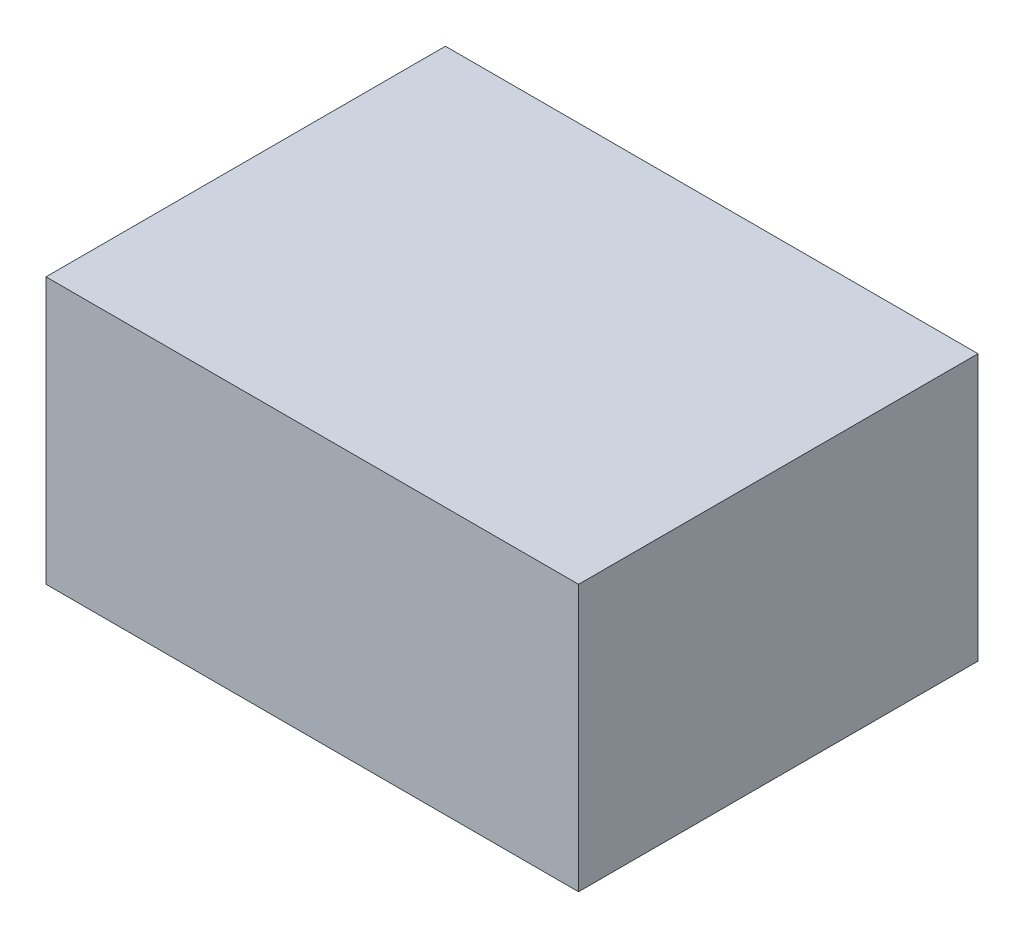
ISO-10303-21;
HEADER;
FILE_DESCRIPTION(('STEP AP214'),'2;1');
FILE_NAME('part.step','',(''),(''),'','','');
FILE_SCHEMA(('AUTOMOTIVE_DESIGN { 1 0 10303 214 1 1 1 1 }'));
ENDSEC;
DATA;
#1=APPLICATION_CONTEXT('core data for automotive mechanical design processes');
#2=APPLICATION_PROTOCOL_DEFINITION('international standard','automotive_design',2000,#1);
#3=PRODUCT_CONTEXT('',#1,'mechanical');
#4=PRODUCT('Part','Part','',(#3));
#5=PRODUCT_RELATED_PRODUCT_CATEGORY('part','',(#4));
#6=PRODUCT_DEFINITION_FORMATION('','',#4);
#7=PRODUCT_DEFINITION_CONTEXT('part definition',#1,'design');
#8=PRODUCT_DEFINITION('design','',#6,#7);
#9=PRODUCT_DEFINITION_SHAPE('','',#8);
#10=(LENGTH_UNIT() NAMED_UNIT(*) SI_UNIT(.MILLI.,.METRE.));
#11=(NAMED_UNIT(*) PLANE_ANGLE_UNIT() SI_UNIT($,.RADIAN.));
#12=(NAMED_UNIT(*) SI_UNIT($,.STERADIAN.) SOLID_ANGLE_UNIT());
#13=UNCERTAINTY_MEASURE_WITH_UNIT(LENGTH_MEASURE(1.E-05),#10,'distance_accuracy_value','');
#14=(GEOMETRIC_REPRESENTATION_CONTEXT(3) GLOBAL_UNCERTAINTY_ASSIGNED_CONTEXT((#13)) GLOBAL_UNIT_ASSIGNED_CONTEXT((#10,
#11,#12)) REPRESENTATION_CONTEXT('',''));
#15=CARTESIAN_POINT('',(0.,0.,0.));
#16=DIRECTION('',(0.,0.,1.));
#17=DIRECTION('',(1.,0.,0.));
#18=AXIS2_PLACEMENT_3D('',#15,#16,#17);
#19=CARTESIAN_POINT('',(-60.,30.,-45.));
#20=DIRECTION('',(1.,0.,0.));
#21=DIRECTION('',(0.,0.,-1.));
#22=AXIS2_PLACEMENT_3D('',#19,#20,#21);
#23=PLANE('',#22);
#24=DIRECTION('',(0.,0.,1.));
#25=VECTOR('',#24,1.);
#26=CARTESIAN_POINT('',(-60.,0.,-45.));
#27=LINE('',#26,#25);
#28=CARTESIAN_POINT('',(-60.,0.,-45.));
#29=VERTEX_POINT('',#28);
#30=CARTESIAN_POINT('',(-60.,0.,0.));
#31=VERTEX_POINT('',#30);
#32=EDGE_CURVE('E243',#29,#31,#27,.T.);
#33=ORIENTED_EDGE('',*,*,#32,.T.);
#34=DIRECTION('',(0.,-1.,0.));
#35=VECTOR('',#34,1.);
#36=CARTESIAN_POINT('',(-60.,30.,0.));
#37=LINE('',#36,#35);
#38=CARTESIAN_POINT('',(-60.,30.,0.));
#39=VERTEX_POINT('',#38);
#40=EDGE_CURVE('E295',#39,#31,#37,.T.);
#41=ORIENTED_EDGE('',*,*,#40,.F.);
#42=DIRECTION('',(0.,0.,1.));
#43=VECTOR('',#42,1.);
#44=CARTESIAN_POINT('',(-60.,30.,-45.));
#45=LINE('',#44,#43);
#46=CARTESIAN_POINT('',(-60.,30.,-45.));
#47=VERTEX_POINT('',#46);
#48=EDGE_CURVE('E268',#47,#39,#45,.T.);
#49=ORIENTED_EDGE('',*,*,#48,.F.);
#50=DIRECTION('',(0.,-1.,0.));
#51=VECTOR('',#50,1.);
#52=CARTESIAN_POINT('',(-60.,30.,-45.));
#53=LINE('',#52,#51);
#54=EDGE_CURVE('E278',#47,#29,#53,.T.);
#55=ORIENTED_EDGE('',*,*,#54,.T.);
#56=EDGE_LOOP('',(#33,#41,#49,#55));
#57=FACE_BOUND('',#56,.T.);
#58=ADVANCED_FACE('F38',(#57),#23,.F.);
#59=CARTESIAN_POINT('',(-60.,30.,0.));
#60=DIRECTION('',(0.,0.,-1.));
#61=DIRECTION('',(-1.,0.,0.));
#62=AXIS2_PLACEMENT_3D('',#59,#60,#61);
#63=PLANE('',#62);
#64=DIRECTION('',(1.,0.,0.));
#65=VECTOR('',#64,1.);
#66=CARTESIAN_POINT('',(-60.,0.,0.));
#67=LINE('',#66,#65);
#68=CARTESIAN_POINT('',(0.,0.,0.));
#69=VERTEX_POINT('',#68);
#70=EDGE_CURVE('E281',#31,#69,#67,.T.);
#71=ORIENTED_EDGE('',*,*,#70,.T.);
#72=DIRECTION('',(0.,-1.,0.));
#73=VECTOR('',#72,1.);
#74=CARTESIAN_POINT('',(0.,30.,0.));
#75=LINE('',#74,#73);
#76=CARTESIAN_POINT('',(0.,30.,0.));
#77=VERTEX_POINT('',#76);
#78=EDGE_CURVE('E292',#77,#69,#75,.T.);
#79=ORIENTED_EDGE('',*,*,#78,.F.);
#80=DIRECTION('',(1.,0.,0.));
#81=VECTOR('',#80,1.);
#82=CARTESIAN_POINT('',(-60.,30.,0.));
#83=LINE('',#82,#81);
#84=EDGE_CURVE('E271',#39,#77,#83,.T.);
#85=ORIENTED_EDGE('',*,*,#84,.F.);
#86=ORIENTED_EDGE('',*,*,#40,.T.);
#87=EDGE_LOOP('',(#71,#79,#85,#86));
#88=FACE_BOUND('',#87,.T.);
#89=ADVANCED_FACE('F419',(#88),#63,.F.);
#90=CARTESIAN_POINT('',(0.,30.,-45.));
#91=DIRECTION('',(-1.,0.,0.));
#92=DIRECTION('',(0.,0.,1.));
#93=AXIS2_PLACEMENT_3D('',#90,#91,#92);
#94=PLANE('',#93);
#95=DIRECTION('',(0.,0.,-1.));
#96=VECTOR('',#95,1.);
#97=CARTESIAN_POINT('',(0.,0.,-45.));
#98=LINE('',#97,#96);
#99=CARTESIAN_POINT('',(0.,0.,-45.));
#100=VERTEX_POINT('',#99);
#101=EDGE_CURVE('E283',#69,#100,#98,.T.);
#102=ORIENTED_EDGE('',*,*,#101,.T.);
#103=DIRECTION('',(0.,-1.,0.));
#104=VECTOR('',#103,1.);
#105=CARTESIAN_POINT('',(0.,30.,-45.));
#106=LINE('',#105,#104);
#107=CARTESIAN_POINT('',(0.,30.,-45.));
#108=VERTEX_POINT('',#107);
#109=EDGE_CURVE('E289',#108,#100,#106,.T.);
#110=ORIENTED_EDGE('',*,*,#109,.F.);
#111=DIRECTION('',(0.,0.,-1.));
#112=VECTOR('',#111,1.);
#113=CARTESIAN_POINT('',(0.,30.,-45.));
#114=LINE('',#113,#112);
#115=EDGE_CURVE('E274',#77,#108,#114,.T.);
#116=ORIENTED_EDGE('',*,*,#115,.F.);
#117=ORIENTED_EDGE('',*,*,#78,.T.);
#118=EDGE_LOOP('',(#102,#110,#116,#117));
#119=FACE_BOUND('',#118,.T.);
#120=ADVANCED_FACE('F425',(#119),#94,.F.);
#121=CARTESIAN_POINT('',(-60.,30.,-45.));
#122=DIRECTION('',(0.,0.,1.));
#123=DIRECTION('',(1.,0.,0.));
#124=AXIS2_PLACEMENT_3D('',#121,#122,#123);
#125=PLANE('',#124);
#126=DIRECTION('',(-1.,0.,0.));
#127=VECTOR('',#126,1.);
#128=CARTESIAN_POINT('',(-60.,0.,-45.));
#129=LINE('',#128,#127);
#130=CARTESIAN_POINT('',(-10.,0.,-45.));
#131=VERTEX_POINT('',#130);
#132=EDGE_CURVE('E272',#100,#131,#129,.T.);
#133=ORIENTED_EDGE('',*,*,#132,.T.);
#134=CARTESIAN_POINT('',(-31.4567665220585,-5.01843955542225,-45.));
#135=DIRECTION('',(0.,0.,-1.));
#136=DIRECTION('',(-1.,0.,0.));
#137=AXIS2_PLACEMENT_3D('',#134,#135,#136);
#138=CIRCLE('',#137,22.0358245852875);
#139=CARTESIAN_POINT('',(-45.7403152551447,11.7612446115433,-45.));
#140=VERTEX_POINT('',#139);
#141=EDGE_CURVE('E684',#140,#131,#138,.T.);
#142=ORIENTED_EDGE('',*,*,#141,.F.);
#143=CARTESIAN_POINT('',(-43.6438029015325,9.29835420502508,-45.));
#144=DIRECTION('',(0.,0.,-1.));
#145=DIRECTION('',(-1.,0.,0.));
#146=AXIS2_PLACEMENT_3D('',#143,#144,#145);
#147=CIRCLE('',#146,3.23437678747662);
#148=CARTESIAN_POINT('',(-42.3978743775355,6.31358364157164,-45.));
#149=VERTEX_POINT('',#148);
#150=EDGE_CURVE('E689',#149,#140,#147,.T.);
#151=ORIENTED_EDGE('',*,*,#150,.F.);
#152=CARTESIAN_POINT('',(-38.383580329191,-3.30313712352215,-45.));
#153=DIRECTION('',(0.,0.,1.));
#154=DIRECTION('',(1.,0.,0.));
#155=AXIS2_PLACEMENT_3D('',#152,#153,#154);
#156=CIRCLE('',#155,10.4209344581165);
#157=CARTESIAN_POINT('',(-28.5,0.,-45.));
#158=VERTEX_POINT('',#157);
#159=EDGE_CURVE('E687',#158,#149,#156,.T.);
#160=ORIENTED_EDGE('',*,*,#159,.F.);
#161=EDGE_CURVE('E219',#158,#29,#129,.T.);
#162=ORIENTED_EDGE('',*,*,#161,.T.);
#163=ORIENTED_EDGE('',*,*,#54,.F.);
#164=DIRECTION('',(-1.,0.,0.));
#165=VECTOR('',#164,1.);
#166=CARTESIAN_POINT('',(-60.,30.,-45.));
#167=LINE('',#166,#165);
#168=EDGE_CURVE('E276',#108,#47,#167,.T.);
#169=ORIENTED_EDGE('',*,*,#168,.F.);
#170=ORIENTED_EDGE('',*,*,#109,.T.);
#171=EDGE_LOOP('',(#133,#142,#151,#160,#162,#163,#169,#170));
#172=FACE_BOUND('',#171,.T.);
#173=ADVANCED_FACE('F587',(#172),#125,.F.);
#174=CARTESIAN_POINT('',(0.,30.,0.));
#175=DIRECTION('',(0.,1.,0.));
#176=DIRECTION('',(0.,0.,1.));
#177=AXIS2_PLACEMENT_3D('',#174,#175,#176);
#178=PLANE('',#177);
#179=ORIENTED_EDGE('',*,*,#48,.T.);
#180=ORIENTED_EDGE('',*,*,#84,.T.);
#181=ORIENTED_EDGE('',*,*,#115,.T.);
#182=ORIENTED_EDGE('',*,*,#168,.T.);
#183=EDGE_LOOP('',(#179,#180,#181,#182));
#184=FACE_BOUND('',#183,.T.);
#185=ADVANCED_FACE('F413',(#184),#178,.T.);
#186=CARTESIAN_POINT('',(0.,0.,0.));
#187=DIRECTION('',(0.,1.,0.));
#188=DIRECTION('',(0.,0.,1.));
#189=AXIS2_PLACEMENT_3D('',#186,#187,#188);
#190=PLANE('',#189);
#191=DIRECTION('',(1.,0.,0.));
#192=VECTOR('',#191,1.);
#193=CARTESIAN_POINT('',(-51.,0.,-29.));
#194=LINE('',#193,#192);
#195=CARTESIAN_POINT('',(-51.,0.,-29.));
#196=VERTEX_POINT('',#195);
#197=CARTESIAN_POINT('',(-43.,0.,-29.));
#198=VERTEX_POINT('',#197);
#199=EDGE_CURVE('E230',#196,#198,#194,.T.);
#200=ORIENTED_EDGE('',*,*,#199,.F.);
#201=DIRECTION('',(0.,0.,-1.));
#202=VECTOR('',#201,1.);
#203=CARTESIAN_POINT('',(-51.,0.,-13.));
#204=LINE('',#203,#202);
#205=CARTESIAN_POINT('',(-51.,0.,-13.));
#206=VERTEX_POINT('',#205);
#207=EDGE_CURVE('E227',#206,#196,#204,.T.);
#208=ORIENTED_EDGE('',*,*,#207,.F.);
#209=DIRECTION('',(-1.,0.,0.));
#210=VECTOR('',#209,1.);
#211=CARTESIAN_POINT('',(-51.,0.,-13.));
#212=LINE('',#211,#210);
#213=CARTESIAN_POINT('',(-43.,0.,-13.));
#214=VERTEX_POINT('',#213);
#215=EDGE_CURVE('E237',#214,#206,#212,.T.);
#216=ORIENTED_EDGE('',*,*,#215,.F.);
#217=DIRECTION('',(0.,0.,1.));
#218=VECTOR('',#217,1.);
#219=CARTESIAN_POINT('',(-43.,0.,-13.));
#220=LINE('',#219,#218);
#221=EDGE_CURVE('E234',#198,#214,#220,.T.);
#222=ORIENTED_EDGE('',*,*,#221,.F.);
#223=EDGE_LOOP('',(#200,#208,#216,#222));
#224=FACE_BOUND('',#223,.T.);
#225=DIRECTION('',(1.,0.,0.));
#226=VECTOR('',#225,1.);
#227=CARTESIAN_POINT('',(-17.,0.,-29.));
#228=LINE('',#227,#226);
#229=CARTESIAN_POINT('',(-17.,0.,-29.));
#230=VERTEX_POINT('',#229);
#231=CARTESIAN_POINT('',(-9.,0.,-29.));
#232=VERTEX_POINT('',#231);
#233=EDGE_CURVE('E252',#230,#232,#228,.T.);
#234=ORIENTED_EDGE('',*,*,#233,.F.);
#235=DIRECTION('',(0.,0.,-1.));
#236=VECTOR('',#235,1.);
#237=CARTESIAN_POINT('',(-17.,0.,-13.));
#238=LINE('',#237,#236);
#239=CARTESIAN_POINT('',(-17.,0.,-13.));
#240=VERTEX_POINT('',#239);
#241=EDGE_CURVE('E249',#240,#230,#238,.T.);
#242=ORIENTED_EDGE('',*,*,#241,.F.);
#243=DIRECTION('',(-1.,0.,0.));
#244=VECTOR('',#243,1.);
#245=CARTESIAN_POINT('',(-17.,0.,-13.));
#246=LINE('',#245,#244);
#247=CARTESIAN_POINT('',(-9.,0.,-13.));
#248=VERTEX_POINT('',#247);
#249=EDGE_CURVE('E258',#248,#240,#246,.T.);
#250=ORIENTED_EDGE('',*,*,#249,.F.);
#251=DIRECTION('',(0.,0.,1.));
#252=VECTOR('',#251,1.);
#253=CARTESIAN_POINT('',(-9.,0.,-13.));
#254=LINE('',#253,#252);
#255=EDGE_CURVE('E255',#232,#248,#254,.T.);
#256=ORIENTED_EDGE('',*,*,#255,.F.);
#257=EDGE_LOOP('',(#234,#242,#250,#256));
#258=FACE_BOUND('',#257,.T.);
#259=DIRECTION('',(-1.,0.,0.));
#260=VECTOR('',#259,1.);
#261=CARTESIAN_POINT('',(-10.,0.,-35.));
#262=LINE('',#261,#260);
#263=CARTESIAN_POINT('',(-10.,0.,-35.));
#264=VERTEX_POINT('',#263);
#265=CARTESIAN_POINT('',(-28.5,0.,-35.));
#266=VERTEX_POINT('',#265);
#267=EDGE_CURVE('E209',#264,#266,#262,.T.);
#268=ORIENTED_EDGE('',*,*,#267,.F.);
#269=DIRECTION('',(0.,0.,-1.));
#270=VECTOR('',#269,1.);
#271=CARTESIAN_POINT('',(-10.,0.,-35.));
#272=LINE('',#271,#270);
#273=EDGE_CURVE('E220',#264,#131,#272,.T.);
#274=ORIENTED_EDGE('',*,*,#273,.T.);
#275=ORIENTED_EDGE('',*,*,#132,.F.);
#276=ORIENTED_EDGE('',*,*,#101,.F.);
#277=ORIENTED_EDGE('',*,*,#70,.F.);
#278=ORIENTED_EDGE('',*,*,#32,.F.);
#279=ORIENTED_EDGE('',*,*,#161,.F.);
#280=DIRECTION('',(0.,0.,-1.));
#281=VECTOR('',#280,1.);
#282=CARTESIAN_POINT('',(-28.5,0.,-35.));
#283=LINE('',#282,#281);
#284=EDGE_CURVE('E204',#266,#158,#283,.T.);
#285=ORIENTED_EDGE('',*,*,#284,.F.);
#286=EDGE_LOOP('',(#268,#274,#275,#276,#277,#278,#279,#285));
#287=FACE_BOUND('',#286,.T.);
#288=ADVANCED_FACE('F217',(#224,#258,#287),#190,.F.);
#289=CARTESIAN_POINT('',(-17.,20.,-13.));
#290=DIRECTION('',(-1.,0.,0.));
#291=DIRECTION('',(0.,0.,1.));
#292=AXIS2_PLACEMENT_3D('',#289,#290,#291);
#293=PLANE('',#292);
#294=DIRECTION('',(0.,-1.,0.));
#295=VECTOR('',#294,1.);
#296=CARTESIAN_POINT('',(-17.,20.,-29.));
#297=LINE('',#296,#295);
#298=CARTESIAN_POINT('',(-17.,5.00000000000057,-29.));
#299=VERTEX_POINT('',#298);
#300=EDGE_CURVE('E261',#299,#230,#297,.T.);
#301=ORIENTED_EDGE('',*,*,#300,.F.);
#302=DIRECTION('',(0.,0.,1.));
#303=VECTOR('',#302,1.);
#304=CARTESIAN_POINT('',(-17.,5.00000000000057,-13.));
#305=LINE('',#304,#303);
#306=CARTESIAN_POINT('',(-17.,5.00000000000057,-13.));
#307=VERTEX_POINT('',#306);
#308=EDGE_CURVE('E309',#299,#307,#305,.T.);
#309=ORIENTED_EDGE('',*,*,#308,.T.);
#310=DIRECTION('',(0.,-1.,0.));
#311=VECTOR('',#310,1.);
#312=CARTESIAN_POINT('',(-17.,20.,-13.));
#313=LINE('',#312,#311);
#314=EDGE_CURVE('E231',#307,#240,#313,.T.);
#315=ORIENTED_EDGE('',*,*,#314,.T.);
#316=ORIENTED_EDGE('',*,*,#241,.T.);
#317=EDGE_LOOP('',(#301,#309,#315,#316));
#318=FACE_BOUND('',#317,.T.);
#319=ADVANCED_FACE('F404',(#318),#293,.F.);
#320=CARTESIAN_POINT('',(-17.,20.,-13.));
#321=DIRECTION('',(0.,0.,1.));
#322=DIRECTION('',(1.,0.,0.));
#323=AXIS2_PLACEMENT_3D('',#320,#321,#322);
#324=PLANE('',#323);
#325=DIRECTION('',(0.0871557427476619,0.996194698091745,0.));
#326=VECTOR('',#325,1.);
#327=CARTESIAN_POINT('',(-15.6876700471111,20.,-13.));
#328=LINE('',#327,#326);
#329=CARTESIAN_POINT('',(-16.1251133647408,15.,-13.));
#330=VERTEX_POINT('',#329);
#331=EDGE_CURVE('E313',#307,#330,#328,.T.);
#332=ORIENTED_EDGE('',*,*,#331,.T.);
#333=DIRECTION('',(1.,0.,0.));
#334=VECTOR('',#333,1.);
#335=CARTESIAN_POINT('',(-17.,15.,-13.));
#336=LINE('',#335,#334);
#337=CARTESIAN_POINT('',(-9.87488663525923,15.,-13.));
#338=VERTEX_POINT('',#337);
#339=EDGE_CURVE('E46',#330,#338,#336,.T.);
#340=ORIENTED_EDGE('',*,*,#339,.T.);
#341=DIRECTION('',(0.0871557427476616,-0.996194698091745,0.));
#342=VECTOR('',#341,1.);
#343=CARTESIAN_POINT('',(-10.3123299528889,20.,-13.));
#344=LINE('',#343,#342);
#345=CARTESIAN_POINT('',(-9.,5.00000000000057,-13.));
#346=VERTEX_POINT('',#345);
#347=EDGE_CURVE('E311',#338,#346,#344,.T.);
#348=ORIENTED_EDGE('',*,*,#347,.T.);
#349=DIRECTION('',(0.,-1.,0.));
#350=VECTOR('',#349,1.);
#351=CARTESIAN_POINT('',(-9.,20.,-13.));
#352=LINE('',#351,#350);
#353=EDGE_CURVE('E263',#346,#248,#352,.T.);
#354=ORIENTED_EDGE('',*,*,#353,.T.);
#355=ORIENTED_EDGE('',*,*,#249,.T.);
#356=ORIENTED_EDGE('',*,*,#314,.F.);
#357=EDGE_LOOP('',(#332,#340,#348,#354,#355,#356));
#358=FACE_BOUND('',#357,.T.);
#359=ADVANCED_FACE('F370',(#358),#324,.F.);
#360=CARTESIAN_POINT('',(-9.,20.,-13.));
#361=DIRECTION('',(1.,0.,0.));
#362=DIRECTION('',(0.,0.,-1.));
#363=AXIS2_PLACEMENT_3D('',#360,#361,#362);
#364=PLANE('',#363);
#365=ORIENTED_EDGE('',*,*,#353,.F.);
#366=DIRECTION('',(0.,0.,-1.));
#367=VECTOR('',#366,1.);
#368=CARTESIAN_POINT('',(-9.,5.00000000000057,-13.));
#369=LINE('',#368,#367);
#370=CARTESIAN_POINT('',(-9.,5.00000000000057,-29.));
#371=VERTEX_POINT('',#370);
#372=EDGE_CURVE('E315',#346,#371,#369,.T.);
#373=ORIENTED_EDGE('',*,*,#372,.T.);
#374=DIRECTION('',(0.,-1.,0.));
#375=VECTOR('',#374,1.);
#376=CARTESIAN_POINT('',(-9.,20.,-29.));
#377=LINE('',#376,#375);
#378=EDGE_CURVE('E265',#371,#232,#377,.T.);
#379=ORIENTED_EDGE('',*,*,#378,.T.);
#380=ORIENTED_EDGE('',*,*,#255,.T.);
#381=EDGE_LOOP('',(#365,#373,#379,#380));
#382=FACE_BOUND('',#381,.T.);
#383=ADVANCED_FACE('F398',(#382),#364,.F.);
#384=CARTESIAN_POINT('',(-17.,20.,-29.));
#385=DIRECTION('',(0.,0.,-1.));
#386=DIRECTION('',(-1.,0.,0.));
#387=AXIS2_PLACEMENT_3D('',#384,#385,#386);
#388=PLANE('',#387);
#389=DIRECTION('',(-0.0871557427476616,0.996194698091745,0.));
#390=VECTOR('',#389,1.);
#391=CARTESIAN_POINT('',(-10.3123299528889,20.,-29.));
#392=LINE('',#391,#390);
#393=CARTESIAN_POINT('',(-9.87488663525922,15.,-29.));
#394=VERTEX_POINT('',#393);
#395=EDGE_CURVE('E304',#371,#394,#392,.T.);
#396=ORIENTED_EDGE('',*,*,#395,.T.);
#397=DIRECTION('',(-1.,0.,0.));
#398=VECTOR('',#397,1.);
#399=CARTESIAN_POINT('',(-17.,15.,-29.));
#400=LINE('',#399,#398);
#401=CARTESIAN_POINT('',(-16.1251133647408,15.,-29.));
#402=VERTEX_POINT('',#401);
#403=EDGE_CURVE('E363',#394,#402,#400,.T.);
#404=ORIENTED_EDGE('',*,*,#403,.T.);
#405=DIRECTION('',(-0.0871557427476619,-0.996194698091745,0.));
#406=VECTOR('',#405,1.);
#407=CARTESIAN_POINT('',(-15.6876700471111,20.,-29.));
#408=LINE('',#407,#406);
#409=EDGE_CURVE('E307',#402,#299,#408,.T.);
#410=ORIENTED_EDGE('',*,*,#409,.T.);
#411=ORIENTED_EDGE('',*,*,#300,.T.);
#412=ORIENTED_EDGE('',*,*,#233,.T.);
#413=ORIENTED_EDGE('',*,*,#378,.F.);
#414=EDGE_LOOP('',(#396,#404,#410,#411,#412,#413));
#415=FACE_BOUND('',#414,.T.);
#416=ADVANCED_FACE('F394',(#415),#388,.F.);
#417=CARTESIAN_POINT('',(0.,20.,0.));
#418=DIRECTION('',(0.,-1.,0.));
#419=DIRECTION('',(0.,0.,-1.));
#420=AXIS2_PLACEMENT_3D('',#417,#418,#419);
#421=PLANE('',#420);
#422=DIRECTION('',(0.,0.,-1.));
#423=VECTOR('',#422,1.);
#424=CARTESIAN_POINT('',(-15.6876700471111,20.,0.));
#425=LINE('',#424,#423);
#426=CARTESIAN_POINT('',(-15.6876700471111,20.,-18.9587679629711));
#427=VERTEX_POINT('',#426);
#428=CARTESIAN_POINT('',(-15.6876700471111,20.,-23.0412320370289));
#429=VERTEX_POINT('',#428);
#430=EDGE_CURVE('E301',#427,#429,#425,.T.);
#431=ORIENTED_EDGE('',*,*,#430,.T.);
#432=DIRECTION('',(1.,0.,0.));
#433=VECTOR('',#432,1.);
#434=CARTESIAN_POINT('',(0.,20.,-23.0412320370289));
#435=LINE('',#434,#433);
#436=CARTESIAN_POINT('',(-10.3123299528889,20.,-23.0412320370289));
#437=VERTEX_POINT('',#436);
#438=EDGE_CURVE('E356',#429,#437,#435,.T.);
#439=ORIENTED_EDGE('',*,*,#438,.T.);
#440=DIRECTION('',(0.,0.,1.));
#441=VECTOR('',#440,1.);
#442=CARTESIAN_POINT('',(-10.3123299528889,20.,0.));
#443=LINE('',#442,#441);
#444=CARTESIAN_POINT('',(-10.3123299528889,20.,-18.9587679629711));
#445=VERTEX_POINT('',#444);
#446=EDGE_CURVE('E298',#437,#445,#443,.T.);
#447=ORIENTED_EDGE('',*,*,#446,.T.);
#448=DIRECTION('',(-1.,0.,0.));
#449=VECTOR('',#448,1.);
#450=CARTESIAN_POINT('',(0.,20.,-18.9587679629711));
#451=LINE('',#450,#449);
#452=EDGE_CURVE('E353',#445,#427,#451,.T.);
#453=ORIENTED_EDGE('',*,*,#452,.T.);
#454=EDGE_LOOP('',(#431,#439,#447,#453));
#455=FACE_BOUND('',#454,.T.);
#456=ADVANCED_FACE('F383',(#455),#421,.T.);
#457=CARTESIAN_POINT('',(-51.,20.,-13.));
#458=DIRECTION('',(-1.,0.,0.));
#459=DIRECTION('',(0.,0.,1.));
#460=AXIS2_PLACEMENT_3D('',#457,#458,#459);
#461=PLANE('',#460);
#462=DIRECTION('',(0.,-1.,0.));
#463=VECTOR('',#462,1.);
#464=CARTESIAN_POINT('',(-51.,20.,-29.));
#465=LINE('',#464,#463);
#466=CARTESIAN_POINT('',(-51.,5.00000000000056,-29.));
#467=VERTEX_POINT('',#466);
#468=EDGE_CURVE('E240',#467,#196,#465,.T.);
#469=ORIENTED_EDGE('',*,*,#468,.F.);
#470=DIRECTION('',(0.,0.,1.));
#471=VECTOR('',#470,1.);
#472=CARTESIAN_POINT('',(-51.,5.00000000000056,-13.));
#473=LINE('',#472,#471);
#474=CARTESIAN_POINT('',(-51.,5.00000000000056,-13.));
#475=VERTEX_POINT('',#474);
#476=EDGE_CURVE('E328',#467,#475,#473,.T.);
#477=ORIENTED_EDGE('',*,*,#476,.T.);
#478=DIRECTION('',(0.,-1.,0.));
#479=VECTOR('',#478,1.);
#480=CARTESIAN_POINT('',(-51.,20.,-13.));
#481=LINE('',#480,#479);
#482=EDGE_CURVE('E241',#475,#206,#481,.T.);
#483=ORIENTED_EDGE('',*,*,#482,.T.);
#484=ORIENTED_EDGE('',*,*,#207,.T.);
#485=EDGE_LOOP('',(#469,#477,#483,#484));
#486=FACE_BOUND('',#485,.T.);
#487=ADVANCED_FACE('F490',(#486),#461,.F.);
#488=CARTESIAN_POINT('',(-51.,20.,-13.));
#489=DIRECTION('',(0.,0.,1.));
#490=DIRECTION('',(1.,0.,0.));
#491=AXIS2_PLACEMENT_3D('',#488,#489,#490);
#492=PLANE('',#491);
#493=DIRECTION('',(0.0871557427476619,0.996194698091745,0.));
#494=VECTOR('',#493,1.);
#495=CARTESIAN_POINT('',(-49.6876700471111,20.,-13.));
#496=LINE('',#495,#494);
#497=CARTESIAN_POINT('',(-50.1251133647408,15.,-13.));
#498=VERTEX_POINT('',#497);
#499=EDGE_CURVE('E332',#475,#498,#496,.T.);
#500=ORIENTED_EDGE('',*,*,#499,.T.);
#501=DIRECTION('',(1.,0.,0.));
#502=VECTOR('',#501,1.);
#503=CARTESIAN_POINT('',(-51.,15.,-13.));
#504=LINE('',#503,#502);
#505=CARTESIAN_POINT('',(-43.8748866352592,15.,-13.));
#506=VERTEX_POINT('',#505);
#507=EDGE_CURVE('E11',#498,#506,#504,.T.);
#508=ORIENTED_EDGE('',*,*,#507,.T.);
#509=DIRECTION('',(0.087155742747662,-0.996194698091745,0.));
#510=VECTOR('',#509,1.);
#511=CARTESIAN_POINT('',(-44.3123299528889,20.,-13.));
#512=LINE('',#511,#510);
#513=CARTESIAN_POINT('',(-43.,5.0000000000006,-13.));
#514=VERTEX_POINT('',#513);
#515=EDGE_CURVE('E330',#506,#514,#512,.T.);
#516=ORIENTED_EDGE('',*,*,#515,.T.);
#517=DIRECTION('',(0.,-1.,0.));
#518=VECTOR('',#517,1.);
#519=CARTESIAN_POINT('',(-43.,20.,-13.));
#520=LINE('',#519,#518);
#521=EDGE_CURVE('E244',#514,#214,#520,.T.);
#522=ORIENTED_EDGE('',*,*,#521,.T.);
#523=ORIENTED_EDGE('',*,*,#215,.T.);
#524=ORIENTED_EDGE('',*,*,#482,.F.);
#525=EDGE_LOOP('',(#500,#508,#516,#522,#523,#524));
#526=FACE_BOUND('',#525,.T.);
#527=ADVANCED_FACE('F483',(#526),#492,.F.);
#528=CARTESIAN_POINT('',(-43.,20.,-13.));
#529=DIRECTION('',(1.,0.,0.));
#530=DIRECTION('',(0.,0.,-1.));
#531=AXIS2_PLACEMENT_3D('',#528,#529,#530);
#532=PLANE('',#531);
#533=ORIENTED_EDGE('',*,*,#521,.F.);
#534=DIRECTION('',(0.,0.,-1.));
#535=VECTOR('',#534,1.);
#536=CARTESIAN_POINT('',(-43.,5.0000000000006,-13.));
#537=LINE('',#536,#535);
#538=CARTESIAN_POINT('',(-43.,5.0000000000006,-29.));
#539=VERTEX_POINT('',#538);
#540=EDGE_CURVE('E335',#514,#539,#537,.T.);
#541=ORIENTED_EDGE('',*,*,#540,.T.);
#542=DIRECTION('',(0.,-1.,0.));
#543=VECTOR('',#542,1.);
#544=CARTESIAN_POINT('',(-43.,20.,-29.));
#545=LINE('',#544,#543);
#546=EDGE_CURVE('E246',#539,#198,#545,.T.);
#547=ORIENTED_EDGE('',*,*,#546,.T.);
#548=ORIENTED_EDGE('',*,*,#221,.T.);
#549=EDGE_LOOP('',(#533,#541,#547,#548));
#550=FACE_BOUND('',#549,.T.);
#551=ADVANCED_FACE('F480',(#550),#532,.F.);
#552=CARTESIAN_POINT('',(-51.,20.,-29.));
#553=DIRECTION('',(0.,0.,-1.));
#554=DIRECTION('',(-1.,0.,0.));
#555=AXIS2_PLACEMENT_3D('',#552,#553,#554);
#556=PLANE('',#555);
#557=DIRECTION('',(-0.087155742747662,0.996194698091745,0.));
#558=VECTOR('',#557,1.);
#559=CARTESIAN_POINT('',(-44.3123299528889,20.,-29.));
#560=LINE('',#559,#558);
#561=CARTESIAN_POINT('',(-43.8748866352592,15.,-29.));
#562=VERTEX_POINT('',#561);
#563=EDGE_CURVE('E323',#539,#562,#560,.T.);
#564=ORIENTED_EDGE('',*,*,#563,.T.);
#565=DIRECTION('',(-1.,0.,0.));
#566=VECTOR('',#565,1.);
#567=CARTESIAN_POINT('',(-51.,15.,-29.));
#568=LINE('',#567,#566);
#569=CARTESIAN_POINT('',(-50.1251133647408,15.,-29.));
#570=VERTEX_POINT('',#569);
#571=EDGE_CURVE('E347',#562,#570,#568,.T.);
#572=ORIENTED_EDGE('',*,*,#571,.T.);
#573=DIRECTION('',(-0.0871557427476619,-0.996194698091745,0.));
#574=VECTOR('',#573,1.);
#575=CARTESIAN_POINT('',(-49.6876700471111,20.,-29.));
#576=LINE('',#575,#574);
#577=EDGE_CURVE('E326',#570,#467,#576,.T.);
#578=ORIENTED_EDGE('',*,*,#577,.T.);
#579=ORIENTED_EDGE('',*,*,#468,.T.);
#580=ORIENTED_EDGE('',*,*,#199,.T.);
#581=ORIENTED_EDGE('',*,*,#546,.F.);
#582=EDGE_LOOP('',(#564,#572,#578,#579,#580,#581));
#583=FACE_BOUND('',#582,.T.);
#584=ADVANCED_FACE('F474',(#583),#556,.F.);
#585=CARTESIAN_POINT('',(0.,20.,0.));
#586=DIRECTION('',(0.,-1.,0.));
#587=DIRECTION('',(0.,0.,-1.));
#588=AXIS2_PLACEMENT_3D('',#585,#586,#587);
#589=PLANE('',#588);
#590=DIRECTION('',(0.,0.,-1.));
#591=VECTOR('',#590,1.);
#592=CARTESIAN_POINT('',(-49.6876700471111,20.,0.));
#593=LINE('',#592,#591);
#594=CARTESIAN_POINT('',(-49.6876700471111,20.,-18.9587679629711));
#595=VERTEX_POINT('',#594);
#596=CARTESIAN_POINT('',(-49.6876700471111,20.,-23.0412320370289));
#597=VERTEX_POINT('',#596);
#598=EDGE_CURVE('E320',#595,#597,#593,.T.);
#599=ORIENTED_EDGE('',*,*,#598,.T.);
#600=DIRECTION('',(1.,0.,0.));
#601=VECTOR('',#600,1.);
#602=CARTESIAN_POINT('',(0.,20.,-23.0412320370289));
#603=LINE('',#602,#601);
#604=CARTESIAN_POINT('',(-44.3123299528889,20.,-23.0412320370289));
#605=VERTEX_POINT('',#604);
#606=EDGE_CURVE('E340',#597,#605,#603,.T.);
#607=ORIENTED_EDGE('',*,*,#606,.T.);
#608=DIRECTION('',(0.,0.,1.));
#609=VECTOR('',#608,1.);
#610=CARTESIAN_POINT('',(-44.3123299528889,20.,0.));
#611=LINE('',#610,#609);
#612=CARTESIAN_POINT('',(-44.3123299528889,20.,-18.9587679629711));
#613=VERTEX_POINT('',#612);
#614=EDGE_CURVE('E317',#605,#613,#611,.T.);
#615=ORIENTED_EDGE('',*,*,#614,.T.);
#616=DIRECTION('',(-1.,0.,0.));
#617=VECTOR('',#616,1.);
#618=CARTESIAN_POINT('',(0.,20.,-18.9587679629711));
#619=LINE('',#618,#617);
#620=EDGE_CURVE('E337',#613,#595,#619,.T.);
#621=ORIENTED_EDGE('',*,*,#620,.T.);
#622=EDGE_LOOP('',(#599,#607,#615,#621));
#623=FACE_BOUND('',#622,.T.);
#624=ADVANCED_FACE('F432',(#623),#589,.T.);
#625=CARTESIAN_POINT('',(-15.6876700471111,20.,0.));
#626=DIRECTION('',(-0.996194698091745,0.0871557427476619,0.));
#627=DIRECTION('',(0.,0.,-1.));
#628=AXIS2_PLACEMENT_3D('',#625,#626,#627);
#629=PLANE('',#628);
#630=ORIENTED_EDGE('',*,*,#409,.F.);
#631=DIRECTION('',(0.0561479134605437,0.641773587544905,0.764835978588723));
#632=VECTOR('',#631,1.);
#633=CARTESIAN_POINT('',(-15.6382132838552,20.5652933907409,-22.3675416077437));
#634=LINE('',#633,#632);
#635=EDGE_CURVE('E366',#402,#429,#634,.T.);
#636=ORIENTED_EDGE('',*,*,#635,.T.);
#637=ORIENTED_EDGE('',*,*,#430,.F.);
#638=DIRECTION('',(-0.0561479134605437,-0.641773587544905,0.764835978588723));
#639=VECTOR('',#638,1.);
#640=CARTESIAN_POINT('',(-15.6382132838552,20.5652933907409,-19.6324583922563));
#641=LINE('',#640,#639);
#642=EDGE_CURVE('E61',#427,#330,#641,.T.);
#643=ORIENTED_EDGE('',*,*,#642,.T.);
#644=ORIENTED_EDGE('',*,*,#331,.F.);
#645=ORIENTED_EDGE('',*,*,#308,.F.);
#646=EDGE_LOOP('',(#630,#636,#637,#643,#644,#645));
#647=FACE_BOUND('',#646,.T.);
#648=ADVANCED_FACE('F386',(#647),#629,.F.);
#649=CARTESIAN_POINT('',(-10.3123299528889,20.,0.));
#650=DIRECTION('',(0.996194698091745,0.0871557427476616,0.));
#651=DIRECTION('',(0.,0.,1.));
#652=AXIS2_PLACEMENT_3D('',#649,#650,#651);
#653=PLANE('',#652);
#654=ORIENTED_EDGE('',*,*,#446,.F.);
#655=DIRECTION('',(0.0561479134605437,-0.641773587544905,-0.764835978588723));
#656=VECTOR('',#655,1.);
#657=CARTESIAN_POINT('',(-10.2798194233095,19.6284029465178,-23.4840841605137));
#658=LINE('',#657,#656);
#659=EDGE_CURVE('E361',#437,#394,#658,.T.);
#660=ORIENTED_EDGE('',*,*,#659,.T.);
#661=ORIENTED_EDGE('',*,*,#395,.F.);
#662=ORIENTED_EDGE('',*,*,#372,.F.);
#663=ORIENTED_EDGE('',*,*,#347,.F.);
#664=DIRECTION('',(-0.0561479134605435,0.641773587544905,-0.764835978588723));
#665=VECTOR('',#664,1.);
#666=CARTESIAN_POINT('',(-10.2798194233095,19.6284029465178,-18.5159158394863));
#667=LINE('',#666,#665);
#668=EDGE_CURVE('E359',#338,#445,#667,.T.);
#669=ORIENTED_EDGE('',*,*,#668,.T.);
#670=EDGE_LOOP('',(#654,#660,#661,#662,#663,#669));
#671=FACE_BOUND('',#670,.T.);
#672=ADVANCED_FACE('F378',(#671),#653,.F.);
#673=CARTESIAN_POINT('',(-49.6876700471111,20.,0.));
#674=DIRECTION('',(-0.996194698091745,0.0871557427476618,0.));
#675=DIRECTION('',(0.,0.,-1.));
#676=AXIS2_PLACEMENT_3D('',#673,#674,#675);
#677=PLANE('',#676);
#678=ORIENTED_EDGE('',*,*,#577,.F.);
#679=DIRECTION('',(0.056147913460544,0.641773587544905,0.764835978588723));
#680=VECTOR('',#679,1.);
#681=CARTESIAN_POINT('',(-49.5310252855321,21.7904578178019,-20.9074475002751));
#682=LINE('',#681,#680);
#683=EDGE_CURVE('E351',#570,#597,#682,.T.);
#684=ORIENTED_EDGE('',*,*,#683,.T.);
#685=ORIENTED_EDGE('',*,*,#598,.F.);
#686=DIRECTION('',(-0.0561479134605434,-0.641773587544905,0.764835978588723));
#687=VECTOR('',#686,1.);
#688=CARTESIAN_POINT('',(-49.5310252855321,21.7904578178018,-21.0925524997248));
#689=LINE('',#688,#687);
#690=EDGE_CURVE('E349',#595,#498,#689,.T.);
#691=ORIENTED_EDGE('',*,*,#690,.T.);
#692=ORIENTED_EDGE('',*,*,#499,.F.);
#693=ORIENTED_EDGE('',*,*,#476,.F.);
#694=EDGE_LOOP('',(#678,#684,#685,#691,#692,#693));
#695=FACE_BOUND('',#694,.T.);
#696=ADVANCED_FACE('F435',(#695),#677,.F.);
#697=CARTESIAN_POINT('',(-44.3123299528889,20.,0.));
#698=DIRECTION('',(0.996194698091745,0.087155742747662,0.));
#699=DIRECTION('',(0.,0.,1.));
#700=AXIS2_PLACEMENT_3D('',#697,#698,#699);
#701=PLANE('',#700);
#702=ORIENTED_EDGE('',*,*,#614,.F.);
#703=DIRECTION('',(0.0561479134605438,-0.641773587544905,-0.764835978588723));
#704=VECTOR('',#703,1.);
#705=CARTESIAN_POINT('',(-44.1726314249865,18.4032385194568,-24.9441782679823));
#706=LINE('',#705,#704);
#707=EDGE_CURVE('E345',#605,#562,#706,.T.);
#708=ORIENTED_EDGE('',*,*,#707,.T.);
#709=ORIENTED_EDGE('',*,*,#563,.F.);
#710=ORIENTED_EDGE('',*,*,#540,.F.);
#711=ORIENTED_EDGE('',*,*,#515,.F.);
#712=DIRECTION('',(-0.0561479134605438,0.641773587544905,-0.764835978588723));
#713=VECTOR('',#712,1.);
#714=CARTESIAN_POINT('',(-44.1726314249865,18.4032385194568,-17.0558217320177));
#715=LINE('',#714,#713);
#716=EDGE_CURVE('E343',#506,#613,#715,.T.);
#717=ORIENTED_EDGE('',*,*,#716,.T.);
#718=EDGE_LOOP('',(#702,#708,#709,#710,#711,#717));
#719=FACE_BOUND('',#718,.T.);
#720=ADVANCED_FACE('F438',(#719),#701,.F.);
#721=CARTESIAN_POINT('',(0.,20.,-23.0412320370289));
#722=DIRECTION('',(0.,0.766044443118981,-0.642787609686535));
#723=DIRECTION('',(1.,0.,0.));
#724=AXIS2_PLACEMENT_3D('',#721,#722,#723);
#725=PLANE('',#724);
#726=ORIENTED_EDGE('',*,*,#683,.F.);
#727=ORIENTED_EDGE('',*,*,#571,.F.);
#728=ORIENTED_EDGE('',*,*,#707,.F.);
#729=ORIENTED_EDGE('',*,*,#606,.F.);
#730=EDGE_LOOP('',(#726,#727,#728,#729));
#731=FACE_BOUND('',#730,.T.);
#732=ADVANCED_FACE('F442',(#731),#725,.F.);
#733=CARTESIAN_POINT('',(0.,20.,-23.0412320370289));
#734=DIRECTION('',(0.,0.766044443118981,-0.642787609686536));
#735=DIRECTION('',(1.,0.,0.));
#736=AXIS2_PLACEMENT_3D('',#733,#734,#735);
#737=PLANE('',#736);
#738=ORIENTED_EDGE('',*,*,#635,.F.);
#739=ORIENTED_EDGE('',*,*,#403,.F.);
#740=ORIENTED_EDGE('',*,*,#659,.F.);
#741=ORIENTED_EDGE('',*,*,#438,.F.);
#742=EDGE_LOOP('',(#738,#739,#740,#741));
#743=FACE_BOUND('',#742,.T.);
#744=ADVANCED_FACE('F391',(#743),#737,.F.);
#745=CARTESIAN_POINT('',(0.,20.,-18.9587679629711));
#746=DIRECTION('',(0.,0.766044443118981,0.642787609686535));
#747=DIRECTION('',(-1.,0.,0.));
#748=AXIS2_PLACEMENT_3D('',#745,#746,#747);
#749=PLANE('',#748);
#750=ORIENTED_EDGE('',*,*,#668,.F.);
#751=ORIENTED_EDGE('',*,*,#339,.F.);
#752=ORIENTED_EDGE('',*,*,#642,.F.);
#753=ORIENTED_EDGE('',*,*,#452,.F.);
#754=EDGE_LOOP('',(#750,#751,#752,#753));
#755=FACE_BOUND('',#754,.T.);
#756=ADVANCED_FACE('F381',(#755),#749,.F.);
#757=CARTESIAN_POINT('',(0.,20.,-18.9587679629711));
#758=DIRECTION('',(0.,0.766044443118981,0.642787609686535));
#759=DIRECTION('',(-1.,0.,0.));
#760=AXIS2_PLACEMENT_3D('',#757,#758,#759);
#761=PLANE('',#760);
#762=ORIENTED_EDGE('',*,*,#716,.F.);
#763=ORIENTED_EDGE('',*,*,#507,.F.);
#764=ORIENTED_EDGE('',*,*,#690,.F.);
#765=ORIENTED_EDGE('',*,*,#620,.F.);
#766=EDGE_LOOP('',(#762,#763,#764,#765));
#767=FACE_BOUND('',#766,.T.);
#768=ADVANCED_FACE('F40',(#767),#761,.F.);
#769=CARTESIAN_POINT('',(-31.4567665220585,-5.01843955542225,-35.));
#770=DIRECTION('',(0.,0.,-1.));
#771=DIRECTION('',(-1.,0.,0.));
#772=AXIS2_PLACEMENT_3D('',#769,#770,#771);
#773=CYLINDRICAL_SURFACE('',#772,22.0358245852875);
#774=ORIENTED_EDGE('',*,*,#141,.T.);
#775=ORIENTED_EDGE('',*,*,#273,.F.);
#776=CARTESIAN_POINT('',(-31.4567665220585,-5.01843955542225,-35.));
#777=DIRECTION('',(0.,0.,-1.));
#778=DIRECTION('',(-1.,0.,0.));
#779=AXIS2_PLACEMENT_3D('',#776,#777,#778);
#780=CIRCLE('',#779,22.0358245852875);
#781=CARTESIAN_POINT('',(-45.7403152551447,11.7612446115433,-35.));
#782=VERTEX_POINT('',#781);
#783=EDGE_CURVE('E53',#782,#264,#780,.T.);
#784=ORIENTED_EDGE('',*,*,#783,.F.);
#785=DIRECTION('',(0.,0.,-1.));
#786=VECTOR('',#785,1.);
#787=CARTESIAN_POINT('',(-45.7403152551447,11.7612446115433,-35.));
#788=LINE('',#787,#786);
#789=EDGE_CURVE('E222',#782,#140,#788,.T.);
#790=ORIENTED_EDGE('',*,*,#789,.T.);
#791=EDGE_LOOP('',(#774,#775,#784,#790));
#792=FACE_BOUND('',#791,.T.);
#793=ADVANCED_FACE('F452',(#792),#773,.F.);
#794=CARTESIAN_POINT('',(-43.6438029015325,9.29835420502508,-35.));
#795=DIRECTION('',(0.,0.,-1.));
#796=DIRECTION('',(-1.,0.,0.));
#797=AXIS2_PLACEMENT_3D('',#794,#795,#796);
#798=CYLINDRICAL_SURFACE('',#797,3.23437678747662);
#799=ORIENTED_EDGE('',*,*,#150,.T.);
#800=ORIENTED_EDGE('',*,*,#789,.F.);
#801=CARTESIAN_POINT('',(-43.6438029015325,9.29835420502508,-35.));
#802=DIRECTION('',(0.,0.,-1.));
#803=DIRECTION('',(-1.,0.,0.));
#804=AXIS2_PLACEMENT_3D('',#801,#802,#803);
#805=CIRCLE('',#804,3.23437678747662);
#806=CARTESIAN_POINT('',(-42.3978743775355,6.31358364157164,-35.));
#807=VERTEX_POINT('',#806);
#808=EDGE_CURVE('E208',#807,#782,#805,.T.);
#809=ORIENTED_EDGE('',*,*,#808,.F.);
#810=DIRECTION('',(0.,0.,-1.));
#811=VECTOR('',#810,1.);
#812=CARTESIAN_POINT('',(-42.3978743775355,6.31358364157164,-35.));
#813=LINE('',#812,#811);
#814=EDGE_CURVE('E206',#807,#149,#813,.T.);
#815=ORIENTED_EDGE('',*,*,#814,.T.);
#816=EDGE_LOOP('',(#799,#800,#809,#815));
#817=FACE_BOUND('',#816,.T.);
#818=ADVANCED_FACE('F457',(#817),#798,.F.);
#819=CARTESIAN_POINT('',(-38.383580329191,-3.30313712352215,-35.));
#820=DIRECTION('',(0.,0.,-1.));
#821=DIRECTION('',(-1.,0.,0.));
#822=AXIS2_PLACEMENT_3D('',#819,#820,#821);
#823=CYLINDRICAL_SURFACE('',#822,10.4209344581165);
#824=ORIENTED_EDGE('',*,*,#159,.T.);
#825=ORIENTED_EDGE('',*,*,#814,.F.);
#826=CARTESIAN_POINT('',(-38.383580329191,-3.30313712352215,-35.));
#827=DIRECTION('',(0.,0.,1.));
#828=DIRECTION('',(1.,0.,0.));
#829=AXIS2_PLACEMENT_3D('',#826,#827,#828);
#830=CIRCLE('',#829,10.4209344581165);
#831=EDGE_CURVE('E200',#266,#807,#830,.T.);
#832=ORIENTED_EDGE('',*,*,#831,.F.);
#833=ORIENTED_EDGE('',*,*,#284,.T.);
#834=EDGE_LOOP('',(#824,#825,#832,#833));
#835=FACE_BOUND('',#834,.T.);
#836=ADVANCED_FACE('F202',(#835),#823,.T.);
#837=CARTESIAN_POINT('',(-31.4567665220585,-5.01843955542225,-35.));
#838=DIRECTION('',(0.,0.,-1.));
#839=DIRECTION('',(-1.,0.,0.));
#840=AXIS2_PLACEMENT_3D('',#837,#838,#839);
#841=PLANE('',#840);
#842=ORIENTED_EDGE('',*,*,#783,.T.);
#843=ORIENTED_EDGE('',*,*,#267,.T.);
#844=ORIENTED_EDGE('',*,*,#831,.T.);
#845=ORIENTED_EDGE('',*,*,#808,.T.);
#846=EDGE_LOOP('',(#842,#843,#844,#845));
#847=FACE_BOUND('',#846,.T.);
#848=ADVANCED_FACE('F212',(#847),#841,.T.);
#849=CLOSED_SHELL('',(#58,#89,#120,#173,#185,#288,#319,#359,#383,#416,#456,#487,#527,#551,#584,
#624,#648,#672,#696,#720,#732,#744,#756,#768,#793,#818,#836,#848));
#850=MANIFOLD_SOLID_BREP('B2',#849);
#851=ADVANCED_BREP_SHAPE_REPRESENTATION('',(#18,#850),#14);
#852=SHAPE_DEFINITION_REPRESENTATION(#9,#851);
ENDSEC;
END-ISO-10303-21;
